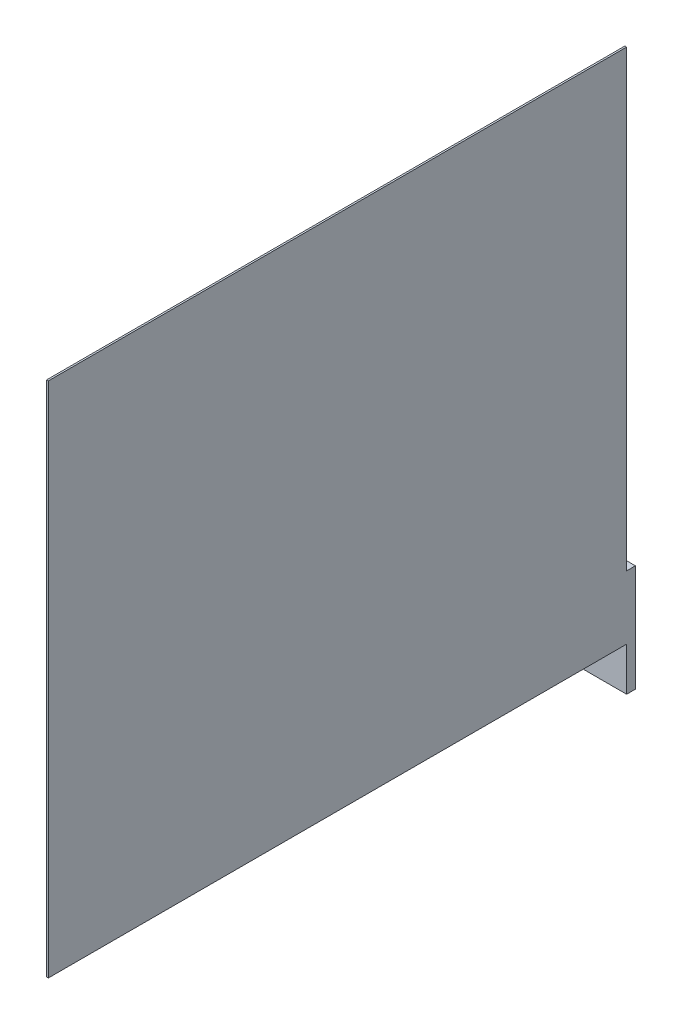
ISO-10303-21;
HEADER;
FILE_DESCRIPTION(('STEP AP214'),'2;1');
FILE_NAME('part.step','',(''),(''),'','','');
FILE_SCHEMA(('AUTOMOTIVE_DESIGN { 1 0 10303 214 1 1 1 1 }'));
ENDSEC;
DATA;
#1=APPLICATION_CONTEXT('core data for automotive mechanical design processes');
#2=APPLICATION_PROTOCOL_DEFINITION('international standard','automotive_design',2000,#1);
#3=PRODUCT_CONTEXT('',#1,'mechanical');
#4=PRODUCT('Part','Part','',(#3));
#5=PRODUCT_RELATED_PRODUCT_CATEGORY('part','',(#4));
#6=PRODUCT_DEFINITION_FORMATION('','',#4);
#7=PRODUCT_DEFINITION_CONTEXT('part definition',#1,'design');
#8=PRODUCT_DEFINITION('design','',#6,#7);
#9=PRODUCT_DEFINITION_SHAPE('','',#8);
#10=(LENGTH_UNIT() NAMED_UNIT(*) SI_UNIT(.MILLI.,.METRE.));
#11=(NAMED_UNIT(*) PLANE_ANGLE_UNIT() SI_UNIT($,.RADIAN.));
#12=(NAMED_UNIT(*) SI_UNIT($,.STERADIAN.) SOLID_ANGLE_UNIT());
#13=UNCERTAINTY_MEASURE_WITH_UNIT(LENGTH_MEASURE(1.E-05),#10,'distance_accuracy_value','');
#14=(GEOMETRIC_REPRESENTATION_CONTEXT(3) GLOBAL_UNCERTAINTY_ASSIGNED_CONTEXT((#13)) GLOBAL_UNIT_ASSIGNED_CONTEXT((#10,
#11,#12)) REPRESENTATION_CONTEXT('',''));
#15=CARTESIAN_POINT('',(0.,0.,0.));
#16=DIRECTION('',(0.,0.,1.));
#17=DIRECTION('',(1.,0.,0.));
#18=AXIS2_PLACEMENT_3D('',#15,#16,#17);
#19=CARTESIAN_POINT('',(-112.641216583219,-73.6484917886695,2.));
#20=DIRECTION('',(0.,1.,0.));
#21=DIRECTION('',(0.,0.,1.));
#22=AXIS2_PLACEMENT_3D('',#19,#20,#21);
#23=PLANE('',#22);
#24=DIRECTION('',(1.,0.,0.));
#25=VECTOR('',#24,1.);
#26=CARTESIAN_POINT('',(-112.641216583219,-73.6484917886695,0.));
#27=LINE('',#26,#25);
#28=CARTESIAN_POINT('',(-112.641216583219,-73.6484917886695,0.));
#29=VERTEX_POINT('',#28);
#30=CARTESIAN_POINT('',(-88.2675227943821,-73.6484917886695,0.));
#31=VERTEX_POINT('',#30);
#32=EDGE_CURVE('E140',#29,#31,#27,.T.);
#33=ORIENTED_EDGE('',*,*,#32,.T.);
#34=DIRECTION('',(0.,0.,-1.));
#35=VECTOR('',#34,1.);
#36=CARTESIAN_POINT('',(-88.2675227943821,-73.6484917886695,2.));
#37=LINE('',#36,#35);
#38=CARTESIAN_POINT('',(-88.2675227943821,-73.6484917886695,2.));
#39=VERTEX_POINT('',#38);
#40=EDGE_CURVE('E174',#39,#31,#37,.T.);
#41=ORIENTED_EDGE('',*,*,#40,.F.);
#42=DIRECTION('',(1.,0.,0.));
#43=VECTOR('',#42,1.);
#44=CARTESIAN_POINT('',(-112.641216583219,-73.6484917886695,2.));
#45=LINE('',#44,#43);
#46=CARTESIAN_POINT('',(-112.641216583219,-73.6484917886695,2.));
#47=VERTEX_POINT('',#46);
#48=EDGE_CURVE('E149',#47,#39,#45,.T.);
#49=ORIENTED_EDGE('',*,*,#48,.F.);
#50=DIRECTION('',(0.,0.,-1.));
#51=VECTOR('',#50,1.);
#52=CARTESIAN_POINT('',(-112.641216583219,-73.6484917886695,2.));
#53=LINE('',#52,#51);
#54=EDGE_CURVE('E160',#47,#29,#53,.T.);
#55=ORIENTED_EDGE('',*,*,#54,.T.);
#56=EDGE_LOOP('',(#33,#41,#49,#55));
#57=FACE_BOUND('',#56,.T.);
#58=ADVANCED_FACE('F41',(#57),#23,.F.);
#59=CARTESIAN_POINT('',(-88.2675227943821,-73.6484917886695,2.));
#60=DIRECTION('',(-1.,0.,0.));
#61=DIRECTION('',(0.,0.,1.));
#62=AXIS2_PLACEMENT_3D('',#59,#60,#61);
#63=PLANE('',#62);
#64=DIRECTION('',(0.,1.,0.));
#65=VECTOR('',#64,1.);
#66=CARTESIAN_POINT('',(-88.2675227943821,-73.6484917886695,0.));
#67=LINE('',#66,#65);
#68=CARTESIAN_POINT('',(-88.2675227943821,-49.2484917886695,0.));
#69=VERTEX_POINT('',#68);
#70=EDGE_CURVE('E143',#31,#69,#67,.T.);
#71=ORIENTED_EDGE('',*,*,#70,.T.);
#72=DIRECTION('',(0.,0.,-1.));
#73=VECTOR('',#72,1.);
#74=CARTESIAN_POINT('',(-88.2675227943821,-49.2484917886695,2.));
#75=LINE('',#74,#73);
#76=CARTESIAN_POINT('',(-88.2675227943821,-49.2484917886695,2.));
#77=VERTEX_POINT('',#76);
#78=EDGE_CURVE('E171',#77,#69,#75,.T.);
#79=ORIENTED_EDGE('',*,*,#78,.F.);
#80=DIRECTION('',(0.,1.,0.));
#81=VECTOR('',#80,1.);
#82=CARTESIAN_POINT('',(-88.2675227943821,-63.737857556412,2.));
#83=LINE('',#82,#81);
#84=CARTESIAN_POINT('',(-88.2675227943821,54.3056927602651,2.));
#85=VERTEX_POINT('',#84);
#86=EDGE_CURVE('E302',#77,#85,#83,.T.);
#87=ORIENTED_EDGE('',*,*,#86,.T.);
#88=DIRECTION('',(0.,0.,-1.));
#89=VECTOR('',#88,1.);
#90=CARTESIAN_POINT('',(-88.2675227943821,54.3056927602651,134.));
#91=LINE('',#90,#89);
#92=CARTESIAN_POINT('',(-88.2675227943821,54.3056927602651,134.));
#93=VERTEX_POINT('',#92);
#94=EDGE_CURVE('E124',#93,#85,#91,.T.);
#95=ORIENTED_EDGE('',*,*,#94,.F.);
#96=DIRECTION('',(0.,1.,0.));
#97=VECTOR('',#96,1.);
#98=CARTESIAN_POINT('',(-88.2675227943821,-63.737857556412,134.));
#99=LINE('',#98,#97);
#100=CARTESIAN_POINT('',(-88.2675227943821,-63.737857556412,134.));
#101=VERTEX_POINT('',#100);
#102=EDGE_CURVE('E118',#101,#93,#99,.T.);
#103=ORIENTED_EDGE('',*,*,#102,.F.);
#104=DIRECTION('',(0.,0.,-1.));
#105=VECTOR('',#104,1.);
#106=CARTESIAN_POINT('',(-88.2675227943821,-63.737857556412,134.));
#107=LINE('',#106,#105);
#108=CARTESIAN_POINT('',(-88.2675227943821,-63.737857556412,2.));
#109=VERTEX_POINT('',#108);
#110=EDGE_CURVE('E122',#101,#109,#107,.T.);
#111=ORIENTED_EDGE('',*,*,#110,.T.);
#112=DIRECTION('',(0.,1.,0.));
#113=VECTOR('',#112,1.);
#114=CARTESIAN_POINT('',(-88.2675227943821,-73.6484917886695,2.));
#115=LINE('',#114,#113);
#116=EDGE_CURVE('E152',#39,#109,#115,.T.);
#117=ORIENTED_EDGE('',*,*,#116,.F.);
#118=ORIENTED_EDGE('',*,*,#40,.T.);
#119=EDGE_LOOP('',(#71,#79,#87,#95,#103,#111,#117,#118));
#120=FACE_BOUND('',#119,.T.);
#121=ADVANCED_FACE('F120',(#120),#63,.F.);
#122=CARTESIAN_POINT('',(-112.641216583219,-49.2484917886695,2.));
#123=DIRECTION('',(0.,-1.,0.));
#124=DIRECTION('',(0.,0.,-1.));
#125=AXIS2_PLACEMENT_3D('',#122,#123,#124);
#126=PLANE('',#125);
#127=DIRECTION('',(-1.,0.,0.));
#128=VECTOR('',#127,1.);
#129=CARTESIAN_POINT('',(-112.641216583219,-49.2484917886695,0.));
#130=LINE('',#129,#128);
#131=CARTESIAN_POINT('',(-112.641216583219,-49.2484917886695,0.));
#132=VERTEX_POINT('',#131);
#133=EDGE_CURVE('E163',#69,#132,#130,.T.);
#134=ORIENTED_EDGE('',*,*,#133,.T.);
#135=DIRECTION('',(0.,0.,-1.));
#136=VECTOR('',#135,1.);
#137=CARTESIAN_POINT('',(-112.641216583219,-49.2484917886695,2.));
#138=LINE('',#137,#136);
#139=CARTESIAN_POINT('',(-112.641216583219,-49.2484917886695,2.));
#140=VERTEX_POINT('',#139);
#141=EDGE_CURVE('E168',#140,#132,#138,.T.);
#142=ORIENTED_EDGE('',*,*,#141,.F.);
#143=DIRECTION('',(-1.,0.,0.));
#144=VECTOR('',#143,1.);
#145=CARTESIAN_POINT('',(-112.641216583219,-49.2484917886695,2.));
#146=LINE('',#145,#144);
#147=CARTESIAN_POINT('',(-98.6668413518657,-49.2484917886695,2.));
#148=VERTEX_POINT('',#147);
#149=EDGE_CURVE('E155',#148,#140,#146,.T.);
#150=ORIENTED_EDGE('',*,*,#149,.F.);
#151=CARTESIAN_POINT('',(-98.6668413518657,-49.2484917886695,12.));
#152=DIRECTION('',(0.,-1.,0.));
#153=DIRECTION('',(0.,0.,-1.));
#154=AXIS2_PLACEMENT_3D('',#151,#152,#153);
#155=CIRCLE('',#154,10.);
#156=CARTESIAN_POINT('',(-88.6668413518657,-49.2484917886695,12.));
#157=VERTEX_POINT('',#156);
#158=EDGE_CURVE('E11',#148,#157,#155,.T.);
#159=ORIENTED_EDGE('',*,*,#158,.T.);
#160=DIRECTION('',(0.,0.,1.));
#161=VECTOR('',#160,1.);
#162=CARTESIAN_POINT('',(-88.6668413518657,-49.2484917886695,2.));
#163=LINE('',#162,#161);
#164=CARTESIAN_POINT('',(-88.6668413518657,-49.2484917886695,2.));
#165=VERTEX_POINT('',#164);
#166=EDGE_CURVE('E55',#165,#157,#163,.T.);
#167=ORIENTED_EDGE('',*,*,#166,.F.);
#168=EDGE_CURVE('E156',#77,#165,#146,.T.);
#169=ORIENTED_EDGE('',*,*,#168,.F.);
#170=ORIENTED_EDGE('',*,*,#78,.T.);
#171=EDGE_LOOP('',(#134,#142,#150,#159,#167,#169,#170));
#172=FACE_BOUND('',#171,.T.);
#173=ADVANCED_FACE('F190',(#172),#126,.F.);
#174=CARTESIAN_POINT('',(-112.641216583219,-73.6484917886695,2.));
#175=DIRECTION('',(1.,0.,0.));
#176=DIRECTION('',(0.,0.,-1.));
#177=AXIS2_PLACEMENT_3D('',#174,#175,#176);
#178=PLANE('',#177);
#179=DIRECTION('',(0.,-1.,0.));
#180=VECTOR('',#179,1.);
#181=CARTESIAN_POINT('',(-112.641216583219,-73.6484917886695,0.));
#182=LINE('',#181,#180);
#183=EDGE_CURVE('E153',#132,#29,#182,.T.);
#184=ORIENTED_EDGE('',*,*,#183,.T.);
#185=ORIENTED_EDGE('',*,*,#54,.F.);
#186=DIRECTION('',(0.,-1.,0.));
#187=VECTOR('',#186,1.);
#188=CARTESIAN_POINT('',(-112.641216583219,-73.6484917886695,2.));
#189=LINE('',#188,#187);
#190=EDGE_CURVE('E159',#140,#47,#189,.T.);
#191=ORIENTED_EDGE('',*,*,#190,.F.);
#192=ORIENTED_EDGE('',*,*,#141,.T.);
#193=EDGE_LOOP('',(#184,#185,#191,#192));
#194=FACE_BOUND('',#193,.T.);
#195=ADVANCED_FACE('F196',(#194),#178,.F.);
#196=CARTESIAN_POINT('',(0.,0.,2.));
#197=DIRECTION('',(0.,0.,1.));
#198=DIRECTION('',(1.,0.,0.));
#199=AXIS2_PLACEMENT_3D('',#196,#197,#198);
#200=PLANE('',#199);
#201=DIRECTION('',(1.,0.,0.));
#202=VECTOR('',#201,1.);
#203=CARTESIAN_POINT('',(-88.2675227943821,-63.737857556412,2.));
#204=LINE('',#203,#202);
#205=CARTESIAN_POINT('',(-98.6668413518657,-63.737857556412,2.));
#206=VERTEX_POINT('',#205);
#207=EDGE_CURVE('E63',#206,#109,#204,.T.);
#208=ORIENTED_EDGE('',*,*,#207,.F.);
#209=DIRECTION('',(0.,-1.,0.));
#210=VECTOR('',#209,1.);
#211=CARTESIAN_POINT('',(-98.6668413518657,0.,2.));
#212=LINE('',#211,#210);
#213=EDGE_CURVE('E181',#206,#148,#212,.F.);
#214=ORIENTED_EDGE('',*,*,#213,.T.);
#215=ORIENTED_EDGE('',*,*,#149,.T.);
#216=ORIENTED_EDGE('',*,*,#190,.T.);
#217=ORIENTED_EDGE('',*,*,#48,.T.);
#218=ORIENTED_EDGE('',*,*,#116,.T.);
#219=EDGE_LOOP('',(#208,#214,#215,#216,#217,#218));
#220=FACE_BOUND('',#219,.T.);
#221=ADVANCED_FACE('F188',(#220),#200,.T.);
#222=CARTESIAN_POINT('',(0.,0.,0.));
#223=DIRECTION('',(0.,0.,1.));
#224=DIRECTION('',(1.,0.,0.));
#225=AXIS2_PLACEMENT_3D('',#222,#223,#224);
#226=PLANE('',#225);
#227=ORIENTED_EDGE('',*,*,#32,.F.);
#228=ORIENTED_EDGE('',*,*,#183,.F.);
#229=ORIENTED_EDGE('',*,*,#133,.F.);
#230=ORIENTED_EDGE('',*,*,#70,.F.);
#231=EDGE_LOOP('',(#227,#228,#229,#230));
#232=FACE_BOUND('',#231,.T.);
#233=ADVANCED_FACE('F203',(#232),#226,.F.);
#234=CARTESIAN_POINT('',(-88.2675227943821,-63.737857556412,134.));
#235=DIRECTION('',(0.,1.,0.));
#236=DIRECTION('',(0.,0.,1.));
#237=AXIS2_PLACEMENT_3D('',#234,#235,#236);
#238=PLANE('',#237);
#239=ORIENTED_EDGE('',*,*,#207,.T.);
#240=ORIENTED_EDGE('',*,*,#110,.F.);
#241=DIRECTION('',(1.,0.,0.));
#242=VECTOR('',#241,1.);
#243=CARTESIAN_POINT('',(-88.2675227943821,-63.737857556412,134.));
#244=LINE('',#243,#242);
#245=CARTESIAN_POINT('',(-88.6668413518657,-63.737857556412,134.));
#246=VERTEX_POINT('',#245);
#247=EDGE_CURVE('E128',#246,#101,#244,.T.);
#248=ORIENTED_EDGE('',*,*,#247,.F.);
#249=DIRECTION('',(0.,0.,-1.));
#250=VECTOR('',#249,1.);
#251=CARTESIAN_POINT('',(-88.6668413518657,-63.737857556412,134.));
#252=LINE('',#251,#250);
#253=CARTESIAN_POINT('',(-88.6668413518657,-63.737857556412,12.));
#254=VERTEX_POINT('',#253);
#255=EDGE_CURVE('E183',#246,#254,#252,.T.);
#256=ORIENTED_EDGE('',*,*,#255,.T.);
#257=CARTESIAN_POINT('',(-98.6668413518657,-63.737857556412,12.));
#258=DIRECTION('',(0.,1.,0.));
#259=DIRECTION('',(0.,0.,1.));
#260=AXIS2_PLACEMENT_3D('',#257,#258,#259);
#261=CIRCLE('',#260,10.);
#262=EDGE_CURVE('E49',#254,#206,#261,.T.);
#263=ORIENTED_EDGE('',*,*,#262,.T.);
#264=EDGE_LOOP('',(#239,#240,#248,#256,#263));
#265=FACE_BOUND('',#264,.T.);
#266=ADVANCED_FACE('F139',(#265),#238,.F.);
#267=CARTESIAN_POINT('',(-88.2675227943821,54.3056927602651,134.));
#268=DIRECTION('',(0.,-1.,0.));
#269=DIRECTION('',(0.,0.,-1.));
#270=AXIS2_PLACEMENT_3D('',#267,#268,#269);
#271=PLANE('',#270);
#272=DIRECTION('',(-1.,0.,0.));
#273=VECTOR('',#272,1.);
#274=CARTESIAN_POINT('',(-88.2675227943821,54.3056927602651,2.));
#275=LINE('',#274,#273);
#276=CARTESIAN_POINT('',(-88.6668413518657,54.3056927602651,2.));
#277=VERTEX_POINT('',#276);
#278=EDGE_CURVE('E304',#85,#277,#275,.T.);
#279=ORIENTED_EDGE('',*,*,#278,.T.);
#280=DIRECTION('',(0.,0.,-1.));
#281=VECTOR('',#280,1.);
#282=CARTESIAN_POINT('',(-88.6668413518657,54.3056927602651,134.));
#283=LINE('',#282,#281);
#284=CARTESIAN_POINT('',(-88.6668413518657,54.3056927602651,134.));
#285=VERTEX_POINT('',#284);
#286=EDGE_CURVE('E145',#285,#277,#283,.T.);
#287=ORIENTED_EDGE('',*,*,#286,.F.);
#288=DIRECTION('',(-1.,0.,0.));
#289=VECTOR('',#288,1.);
#290=CARTESIAN_POINT('',(-88.2675227943821,54.3056927602651,134.));
#291=LINE('',#290,#289);
#292=EDGE_CURVE('E127',#93,#285,#291,.T.);
#293=ORIENTED_EDGE('',*,*,#292,.F.);
#294=ORIENTED_EDGE('',*,*,#94,.T.);
#295=EDGE_LOOP('',(#279,#287,#293,#294));
#296=FACE_BOUND('',#295,.T.);
#297=ADVANCED_FACE('F211',(#296),#271,.F.);
#298=CARTESIAN_POINT('',(-88.6668413518657,-63.737857556412,134.));
#299=DIRECTION('',(1.,0.,0.));
#300=DIRECTION('',(0.,0.,-1.));
#301=AXIS2_PLACEMENT_3D('',#298,#299,#300);
#302=PLANE('',#301);
#303=ORIENTED_EDGE('',*,*,#166,.T.);
#304=DIRECTION('',(0.,-1.,0.));
#305=VECTOR('',#304,1.);
#306=CARTESIAN_POINT('',(-88.6668413518657,-63.737857556412,12.));
#307=LINE('',#306,#305);
#308=EDGE_CURVE('E178',#157,#254,#307,.T.);
#309=ORIENTED_EDGE('',*,*,#308,.T.);
#310=ORIENTED_EDGE('',*,*,#255,.F.);
#311=DIRECTION('',(0.,-1.,0.));
#312=VECTOR('',#311,1.);
#313=CARTESIAN_POINT('',(-88.6668413518657,-63.737857556412,134.));
#314=LINE('',#313,#312);
#315=EDGE_CURVE('E133',#285,#246,#314,.T.);
#316=ORIENTED_EDGE('',*,*,#315,.F.);
#317=ORIENTED_EDGE('',*,*,#286,.T.);
#318=DIRECTION('',(0.,-1.,0.));
#319=VECTOR('',#318,1.);
#320=CARTESIAN_POINT('',(-88.6668413518657,-63.737857556412,2.));
#321=LINE('',#320,#319);
#322=EDGE_CURVE('E137',#277,#165,#321,.T.);
#323=ORIENTED_EDGE('',*,*,#322,.T.);
#324=EDGE_LOOP('',(#303,#309,#310,#316,#317,#323));
#325=FACE_BOUND('',#324,.T.);
#326=ADVANCED_FACE('F263',(#325),#302,.F.);
#327=CARTESIAN_POINT('',(0.,0.,134.));
#328=DIRECTION('',(0.,0.,-1.));
#329=DIRECTION('',(-1.,0.,0.));
#330=AXIS2_PLACEMENT_3D('',#327,#328,#329);
#331=PLANE('',#330);
#332=ORIENTED_EDGE('',*,*,#247,.T.);
#333=ORIENTED_EDGE('',*,*,#102,.T.);
#334=ORIENTED_EDGE('',*,*,#292,.T.);
#335=ORIENTED_EDGE('',*,*,#315,.T.);
#336=EDGE_LOOP('',(#332,#333,#334,#335));
#337=FACE_BOUND('',#336,.T.);
#338=ADVANCED_FACE('F131',(#337),#331,.F.);
#339=CARTESIAN_POINT('',(0.,0.,2.));
#340=DIRECTION('',(0.,0.,-1.));
#341=DIRECTION('',(-1.,0.,0.));
#342=AXIS2_PLACEMENT_3D('',#339,#340,#341);
#343=PLANE('',#342);
#344=ORIENTED_EDGE('',*,*,#86,.F.);
#345=ORIENTED_EDGE('',*,*,#168,.T.);
#346=ORIENTED_EDGE('',*,*,#322,.F.);
#347=ORIENTED_EDGE('',*,*,#278,.F.);
#348=EDGE_LOOP('',(#344,#345,#346,#347));
#349=FACE_BOUND('',#348,.T.);
#350=ADVANCED_FACE('F282',(#349),#343,.T.);
#351=CARTESIAN_POINT('',(-98.6668413518657,-63.737857556412,12.));
#352=DIRECTION('',(0.,-1.,0.));
#353=DIRECTION('',(0.,0.,-1.));
#354=AXIS2_PLACEMENT_3D('',#351,#352,#353);
#355=CYLINDRICAL_SURFACE('',#354,10.);
#356=ORIENTED_EDGE('',*,*,#158,.F.);
#357=ORIENTED_EDGE('',*,*,#213,.F.);
#358=ORIENTED_EDGE('',*,*,#262,.F.);
#359=ORIENTED_EDGE('',*,*,#308,.F.);
#360=EDGE_LOOP('',(#356,#357,#358,#359));
#361=FACE_BOUND('',#360,.T.);
#362=ADVANCED_FACE('F43',(#361),#355,.F.);
#363=CLOSED_SHELL('',(#58,#121,#173,#195,#221,#233,#266,#297,#326,#338,#350,#362));
#364=MANIFOLD_SOLID_BREP('B2',#363);
#365=ADVANCED_BREP_SHAPE_REPRESENTATION('',(#18,#364),#14);
#366=SHAPE_DEFINITION_REPRESENTATION(#9,#365);
ENDSEC;
END-ISO-10303-21;
